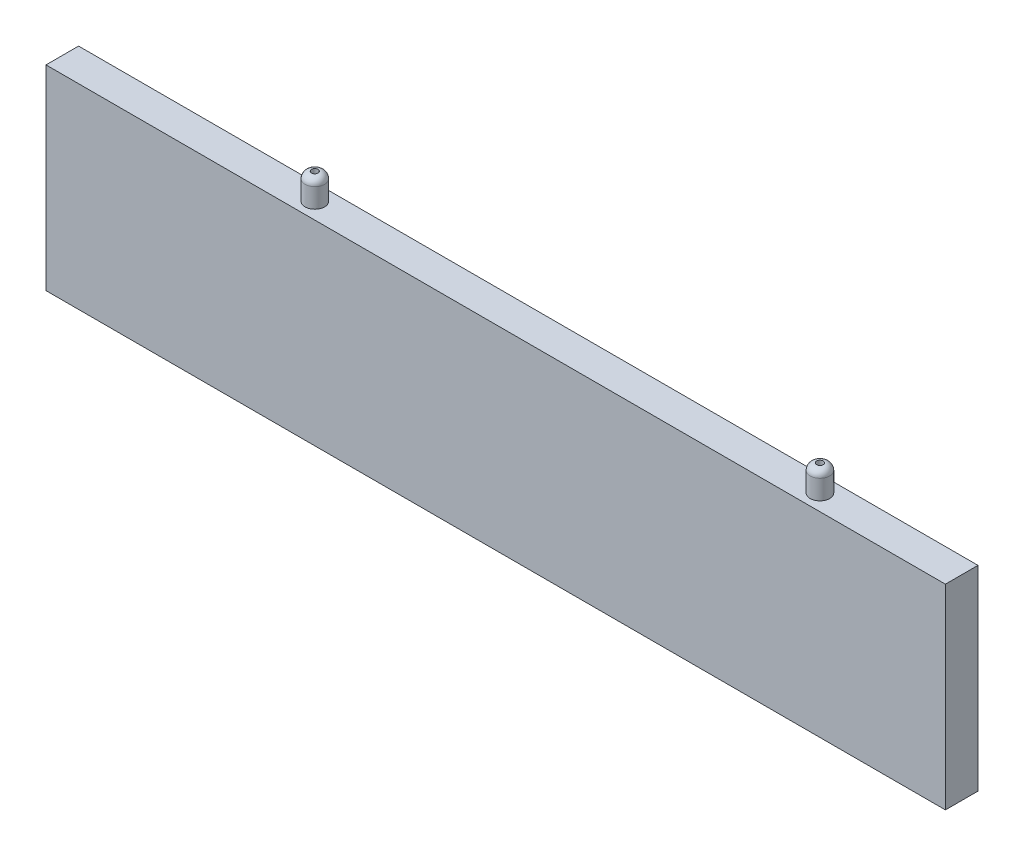
ISO-10303-21;
HEADER;
FILE_DESCRIPTION(('STEP AP214'),'2;1');
FILE_NAME('part.step','',(''),(''),'','','');
FILE_SCHEMA(('AUTOMOTIVE_DESIGN { 1 0 10303 214 1 1 1 1 }'));
ENDSEC;
DATA;
#1=APPLICATION_CONTEXT('core data for automotive mechanical design processes');
#2=APPLICATION_PROTOCOL_DEFINITION('international standard','automotive_design',2000,#1);
#3=PRODUCT_CONTEXT('',#1,'mechanical');
#4=PRODUCT('Part','Part','',(#3));
#5=PRODUCT_RELATED_PRODUCT_CATEGORY('part','',(#4));
#6=PRODUCT_DEFINITION_FORMATION('','',#4);
#7=PRODUCT_DEFINITION_CONTEXT('part definition',#1,'design');
#8=PRODUCT_DEFINITION('design','',#6,#7);
#9=PRODUCT_DEFINITION_SHAPE('','',#8);
#10=(LENGTH_UNIT() NAMED_UNIT(*) SI_UNIT(.MILLI.,.METRE.));
#11=(NAMED_UNIT(*) PLANE_ANGLE_UNIT() SI_UNIT($,.RADIAN.));
#12=(NAMED_UNIT(*) SI_UNIT($,.STERADIAN.) SOLID_ANGLE_UNIT());
#13=UNCERTAINTY_MEASURE_WITH_UNIT(LENGTH_MEASURE(1.E-05),#10,'distance_accuracy_value','');
#14=(GEOMETRIC_REPRESENTATION_CONTEXT(3) GLOBAL_UNCERTAINTY_ASSIGNED_CONTEXT((#13)) GLOBAL_UNIT_ASSIGNED_CONTEXT((#10,
#11,#12)) REPRESENTATION_CONTEXT('',''));
#15=CARTESIAN_POINT('',(0.,0.,0.));
#16=DIRECTION('',(0.,0.,1.));
#17=DIRECTION('',(1.,0.,0.));
#18=AXIS2_PLACEMENT_3D('',#15,#16,#17);
#19=CARTESIAN_POINT('',(-77.5000000000001,15.,5.));
#20=DIRECTION('',(0.,-1.,0.));
#21=DIRECTION('',(0.,0.,-1.));
#22=AXIS2_PLACEMENT_3D('',#19,#20,#21);
#23=PLANE('',#22);
#24=CARTESIAN_POINT('',(-38.75,15.,2.5));
#25=DIRECTION('',(0.,-1.,0.));
#26=DIRECTION('',(0.,0.,-1.));
#27=AXIS2_PLACEMENT_3D('',#24,#25,#26);
#28=CIRCLE('',#27,1.5);
#29=CARTESIAN_POINT('',(-38.75,15.,1.));
#30=VERTEX_POINT('',#29);
#31=EDGE_CURVE('E98',#30,#30,#28,.F.);
#32=ORIENTED_EDGE('',*,*,#31,.F.);
#33=EDGE_LOOP('',(#32));
#34=FACE_BOUND('',#33,.T.);
#35=CARTESIAN_POINT('',(38.75,15.,2.5));
#36=DIRECTION('',(0.,-1.,0.));
#37=DIRECTION('',(0.,0.,-1.));
#38=AXIS2_PLACEMENT_3D('',#35,#36,#37);
#39=CIRCLE('',#38,1.5);
#40=CARTESIAN_POINT('',(38.75,15.,1.));
#41=VERTEX_POINT('',#40);
#42=EDGE_CURVE('E101',#41,#41,#39,.F.);
#43=ORIENTED_EDGE('',*,*,#42,.F.);
#44=EDGE_LOOP('',(#43));
#45=FACE_BOUND('',#44,.T.);
#46=DIRECTION('',(0.,0.,1.));
#47=VECTOR('',#46,1.);
#48=CARTESIAN_POINT('',(60.4999999999999,15.,0.));
#49=LINE('',#48,#47);
#50=CARTESIAN_POINT('',(60.4999999999999,15.,0.));
#51=VERTEX_POINT('',#50);
#52=CARTESIAN_POINT('',(60.4999999999999,15.,5.));
#53=VERTEX_POINT('',#52);
#54=EDGE_CURVE('E137',#51,#53,#49,.T.);
#55=ORIENTED_EDGE('',*,*,#54,.F.);
#56=DIRECTION('',(-1.,0.,0.));
#57=VECTOR('',#56,1.);
#58=CARTESIAN_POINT('',(-77.5000000000001,15.,0.));
#59=LINE('',#58,#57);
#60=CARTESIAN_POINT('',(-77.5000000000001,15.,0.));
#61=VERTEX_POINT('',#60);
#62=EDGE_CURVE('E83',#51,#61,#59,.T.);
#63=ORIENTED_EDGE('',*,*,#62,.T.);
#64=DIRECTION('',(0.,0.,-1.));
#65=VECTOR('',#64,1.);
#66=CARTESIAN_POINT('',(-77.5000000000001,15.,5.));
#67=LINE('',#66,#65);
#68=CARTESIAN_POINT('',(-77.5000000000001,15.,5.));
#69=VERTEX_POINT('',#68);
#70=EDGE_CURVE('E78',#69,#61,#67,.T.);
#71=ORIENTED_EDGE('',*,*,#70,.F.);
#72=DIRECTION('',(-1.,0.,0.));
#73=VECTOR('',#72,1.);
#74=CARTESIAN_POINT('',(-77.5000000000001,15.,5.));
#75=LINE('',#74,#73);
#76=EDGE_CURVE('E92',#53,#69,#75,.T.);
#77=ORIENTED_EDGE('',*,*,#76,.F.);
#78=EDGE_LOOP('',(#55,#63,#71,#77));
#79=FACE_BOUND('',#78,.T.);
#80=ADVANCED_FACE('F35',(#34,#45,#79),#23,.F.);
#81=CARTESIAN_POINT('',(-77.5000000000001,-15.,5.));
#82=DIRECTION('',(0.,1.,0.));
#83=DIRECTION('',(0.,0.,1.));
#84=AXIS2_PLACEMENT_3D('',#81,#82,#83);
#85=PLANE('',#84);
#86=DIRECTION('',(0.,0.,-1.));
#87=VECTOR('',#86,1.);
#88=CARTESIAN_POINT('',(60.4999999999999,-15.,5.));
#89=LINE('',#88,#87);
#90=CARTESIAN_POINT('',(60.4999999999999,-15.,5.));
#91=VERTEX_POINT('',#90);
#92=CARTESIAN_POINT('',(60.4999999999999,-15.,0.));
#93=VERTEX_POINT('',#92);
#94=EDGE_CURVE('E50',#91,#93,#89,.T.);
#95=ORIENTED_EDGE('',*,*,#94,.F.);
#96=DIRECTION('',(1.,0.,0.));
#97=VECTOR('',#96,1.);
#98=CARTESIAN_POINT('',(-77.5000000000001,-15.,5.));
#99=LINE('',#98,#97);
#100=CARTESIAN_POINT('',(-77.5000000000001,-15.,5.));
#101=VERTEX_POINT('',#100);
#102=EDGE_CURVE('E88',#101,#91,#99,.T.);
#103=ORIENTED_EDGE('',*,*,#102,.F.);
#104=DIRECTION('',(0.,0.,-1.));
#105=VECTOR('',#104,1.);
#106=CARTESIAN_POINT('',(-77.5000000000001,-15.,5.));
#107=LINE('',#106,#105);
#108=CARTESIAN_POINT('',(-77.5000000000001,-15.,0.));
#109=VERTEX_POINT('',#108);
#110=EDGE_CURVE('E75',#101,#109,#107,.T.);
#111=ORIENTED_EDGE('',*,*,#110,.T.);
#112=DIRECTION('',(1.,0.,0.));
#113=VECTOR('',#112,1.);
#114=CARTESIAN_POINT('',(-77.5000000000001,-15.,0.));
#115=LINE('',#114,#113);
#116=EDGE_CURVE('E82',#109,#93,#115,.T.);
#117=ORIENTED_EDGE('',*,*,#116,.T.);
#118=EDGE_LOOP('',(#95,#103,#111,#117));
#119=FACE_BOUND('',#118,.T.);
#120=ADVANCED_FACE('F87',(#119),#85,.F.);
#121=CARTESIAN_POINT('',(0.,0.,5.));
#122=DIRECTION('',(0.,0.,1.));
#123=DIRECTION('',(1.,0.,0.));
#124=AXIS2_PLACEMENT_3D('',#121,#122,#123);
#125=PLANE('',#124);
#126=ORIENTED_EDGE('',*,*,#102,.T.);
#127=DIRECTION('',(0.,-1.,0.));
#128=VECTOR('',#127,1.);
#129=CARTESIAN_POINT('',(60.4999999999999,15.,5.));
#130=LINE('',#129,#128);
#131=EDGE_CURVE('E124',#53,#91,#130,.T.);
#132=ORIENTED_EDGE('',*,*,#131,.F.);
#133=ORIENTED_EDGE('',*,*,#76,.T.);
#134=DIRECTION('',(0.,-1.,0.));
#135=VECTOR('',#134,1.);
#136=CARTESIAN_POINT('',(-77.5000000000001,15.,5.));
#137=LINE('',#136,#135);
#138=EDGE_CURVE('E59',#69,#101,#137,.T.);
#139=ORIENTED_EDGE('',*,*,#138,.T.);
#140=EDGE_LOOP('',(#126,#132,#133,#139));
#141=FACE_BOUND('',#140,.T.);
#142=ADVANCED_FACE('F144',(#141),#125,.T.);
#143=CARTESIAN_POINT('',(0.,0.,0.));
#144=DIRECTION('',(0.,0.,1.));
#145=DIRECTION('',(1.,0.,0.));
#146=AXIS2_PLACEMENT_3D('',#143,#144,#145);
#147=PLANE('',#146);
#148=DIRECTION('',(0.,1.,0.));
#149=VECTOR('',#148,1.);
#150=CARTESIAN_POINT('',(60.4999999999999,-15.,0.));
#151=LINE('',#150,#149);
#152=EDGE_CURVE('E91',#93,#51,#151,.T.);
#153=ORIENTED_EDGE('',*,*,#152,.F.);
#154=ORIENTED_EDGE('',*,*,#116,.F.);
#155=DIRECTION('',(0.,-1.,0.));
#156=VECTOR('',#155,1.);
#157=CARTESIAN_POINT('',(-77.5000000000001,15.,0.));
#158=LINE('',#157,#156);
#159=EDGE_CURVE('E72',#61,#109,#158,.T.);
#160=ORIENTED_EDGE('',*,*,#159,.F.);
#161=ORIENTED_EDGE('',*,*,#62,.F.);
#162=EDGE_LOOP('',(#153,#154,#160,#161));
#163=FACE_BOUND('',#162,.T.);
#164=ADVANCED_FACE('F90',(#163),#147,.F.);
#165=CARTESIAN_POINT('',(-77.5000000000001,15.,5.));
#166=DIRECTION('',(1.,0.,0.));
#167=DIRECTION('',(0.,1.,0.));
#168=AXIS2_PLACEMENT_3D('',#165,#166,#167);
#169=PLANE('',#168);
#170=ORIENTED_EDGE('',*,*,#159,.T.);
#171=ORIENTED_EDGE('',*,*,#110,.F.);
#172=ORIENTED_EDGE('',*,*,#138,.F.);
#173=ORIENTED_EDGE('',*,*,#70,.T.);
#174=EDGE_LOOP('',(#170,#171,#172,#173));
#175=FACE_BOUND('',#174,.T.);
#176=ADVANCED_FACE('F74',(#175),#169,.F.);
#177=CARTESIAN_POINT('',(-38.75,19.,2.5));
#178=DIRECTION('',(0.,-1.,0.));
#179=DIRECTION('',(0.,0.,-1.));
#180=AXIS2_PLACEMENT_3D('',#177,#178,#179);
#181=CYLINDRICAL_SURFACE('',#180,1.5);
#182=CARTESIAN_POINT('',(-38.75,18.,2.5));
#183=DIRECTION('',(0.,1.,0.));
#184=DIRECTION('',(0.,0.,1.));
#185=AXIS2_PLACEMENT_3D('',#182,#183,#184);
#186=CIRCLE('',#185,1.5);
#187=CARTESIAN_POINT('',(-38.75,18.,4.));
#188=VERTEX_POINT('',#187);
#189=EDGE_CURVE('E11',#188,#188,#186,.F.);
#190=ORIENTED_EDGE('',*,*,#189,.T.);
#191=EDGE_LOOP('',(#190));
#192=FACE_BOUND('',#191,.T.);
#193=ORIENTED_EDGE('',*,*,#31,.T.);
#194=EDGE_LOOP('',(#193));
#195=FACE_BOUND('',#194,.T.);
#196=ADVANCED_FACE('F177',(#192,#195),#181,.T.);
#197=CARTESIAN_POINT('',(-38.75,19.,2.5));
#198=DIRECTION('',(0.,-1.,0.));
#199=DIRECTION('',(0.,0.,-1.));
#200=AXIS2_PLACEMENT_3D('',#197,#198,#199);
#201=CYLINDRICAL_SURFACE('',#200,0.499999999999999);
#202=CARTESIAN_POINT('',(-38.75,19.,2.5));
#203=DIRECTION('',(0.,1.,0.));
#204=DIRECTION('',(0.,0.,1.));
#205=AXIS2_PLACEMENT_3D('',#202,#203,#204);
#206=CIRCLE('',#205,0.499999999999999);
#207=CARTESIAN_POINT('',(-38.75,19.,3.));
#208=VERTEX_POINT('',#207);
#209=EDGE_CURVE('E121',#208,#208,#206,.T.);
#210=ORIENTED_EDGE('',*,*,#209,.T.);
#211=EDGE_LOOP('',(#210));
#212=FACE_BOUND('',#211,.T.);
#213=CARTESIAN_POINT('',(-38.75,15.,2.5));
#214=DIRECTION('',(0.,1.,0.));
#215=DIRECTION('',(0.,0.,1.));
#216=AXIS2_PLACEMENT_3D('',#213,#214,#215);
#217=CIRCLE('',#216,0.499999999999999);
#218=CARTESIAN_POINT('',(-38.75,15.,3.));
#219=VERTEX_POINT('',#218);
#220=EDGE_CURVE('E117',#219,#219,#217,.T.);
#221=ORIENTED_EDGE('',*,*,#220,.F.);
#222=EDGE_LOOP('',(#221));
#223=FACE_BOUND('',#222,.T.);
#224=ADVANCED_FACE('F168',(#212,#223),#201,.F.);
#225=ORIENTED_EDGE('',*,*,#220,.T.);
#226=EDGE_LOOP('',(#225));
#227=FACE_BOUND('',#226,.T.);
#228=ADVANCED_FACE('F157',(#227),#23,.F.);
#229=CARTESIAN_POINT('',(38.75,19.,2.5));
#230=DIRECTION('',(0.,-1.,0.));
#231=DIRECTION('',(0.,0.,-1.));
#232=AXIS2_PLACEMENT_3D('',#229,#230,#231);
#233=CYLINDRICAL_SURFACE('',#232,1.5);
#234=CARTESIAN_POINT('',(38.75,18.,2.5));
#235=DIRECTION('',(0.,-1.,0.));
#236=DIRECTION('',(0.,0.,-1.));
#237=AXIS2_PLACEMENT_3D('',#234,#235,#236);
#238=CIRCLE('',#237,1.5);
#239=CARTESIAN_POINT('',(38.75,18.,1.));
#240=VERTEX_POINT('',#239);
#241=EDGE_CURVE('E43',#240,#240,#238,.T.);
#242=ORIENTED_EDGE('',*,*,#241,.T.);
#243=EDGE_LOOP('',(#242));
#244=FACE_BOUND('',#243,.T.);
#245=ORIENTED_EDGE('',*,*,#42,.T.);
#246=EDGE_LOOP('',(#245));
#247=FACE_BOUND('',#246,.T.);
#248=ADVANCED_FACE('F106',(#244,#247),#233,.T.);
#249=CARTESIAN_POINT('',(38.75,19.,2.5));
#250=DIRECTION('',(0.,-1.,0.));
#251=DIRECTION('',(0.,0.,-1.));
#252=AXIS2_PLACEMENT_3D('',#249,#250,#251);
#253=CYLINDRICAL_SURFACE('',#252,0.499999999999999);
#254=CARTESIAN_POINT('',(38.75,19.,2.5));
#255=DIRECTION('',(0.,1.,0.));
#256=DIRECTION('',(0.,0.,1.));
#257=AXIS2_PLACEMENT_3D('',#254,#255,#256);
#258=CIRCLE('',#257,0.499999999999999);
#259=CARTESIAN_POINT('',(38.75,19.,3.));
#260=VERTEX_POINT('',#259);
#261=EDGE_CURVE('E115',#260,#260,#258,.T.);
#262=ORIENTED_EDGE('',*,*,#261,.T.);
#263=EDGE_LOOP('',(#262));
#264=FACE_BOUND('',#263,.T.);
#265=CARTESIAN_POINT('',(38.75,15.,2.5));
#266=DIRECTION('',(0.,1.,0.));
#267=DIRECTION('',(0.,0.,1.));
#268=AXIS2_PLACEMENT_3D('',#265,#266,#267);
#269=CIRCLE('',#268,0.499999999999999);
#270=CARTESIAN_POINT('',(38.75,15.,3.));
#271=VERTEX_POINT('',#270);
#272=EDGE_CURVE('E118',#271,#271,#269,.T.);
#273=ORIENTED_EDGE('',*,*,#272,.F.);
#274=EDGE_LOOP('',(#273));
#275=FACE_BOUND('',#274,.T.);
#276=ADVANCED_FACE('F165',(#264,#275),#253,.F.);
#277=ORIENTED_EDGE('',*,*,#272,.T.);
#278=EDGE_LOOP('',(#277));
#279=FACE_BOUND('',#278,.T.);
#280=ADVANCED_FACE('F112',(#279),#23,.F.);
#281=CARTESIAN_POINT('',(38.75,18.,2.5));
#282=DIRECTION('',(0.,-1.,0.));
#283=DIRECTION('',(0.,0.,-1.));
#284=AXIS2_PLACEMENT_3D('',#281,#282,#283);
#285=DEGENERATE_TOROIDAL_SURFACE('',#284,0.499999999999997,1.,.T.);
#286=ORIENTED_EDGE('',*,*,#241,.F.);
#287=EDGE_LOOP('',(#286));
#288=FACE_BOUND('',#287,.T.);
#289=ORIENTED_EDGE('',*,*,#261,.F.);
#290=EDGE_LOOP('',(#289));
#291=FACE_BOUND('',#290,.T.);
#292=ADVANCED_FACE('F109',(#288,#291),#285,.T.);
#293=CARTESIAN_POINT('',(-38.75,18.,2.5));
#294=DIRECTION('',(0.,1.,0.));
#295=DIRECTION('',(0.,0.,1.));
#296=AXIS2_PLACEMENT_3D('',#293,#294,#295);
#297=DEGENERATE_TOROIDAL_SURFACE('',#296,0.499999999999997,1.,.T.);
#298=ORIENTED_EDGE('',*,*,#189,.F.);
#299=EDGE_LOOP('',(#298));
#300=FACE_BOUND('',#299,.T.);
#301=ORIENTED_EDGE('',*,*,#209,.F.);
#302=EDGE_LOOP('',(#301));
#303=FACE_BOUND('',#302,.T.);
#304=ADVANCED_FACE('F37',(#300,#303),#297,.T.);
#305=CARTESIAN_POINT('',(60.4999999999999,0.,0.));
#306=DIRECTION('',(1.,0.,0.));
#307=DIRECTION('',(0.,1.,0.));
#308=AXIS2_PLACEMENT_3D('',#305,#306,#307);
#309=PLANE('',#308);
#310=ORIENTED_EDGE('',*,*,#94,.T.);
#311=ORIENTED_EDGE('',*,*,#152,.T.);
#312=ORIENTED_EDGE('',*,*,#54,.T.);
#313=ORIENTED_EDGE('',*,*,#131,.T.);
#314=EDGE_LOOP('',(#310,#311,#312,#313));
#315=FACE_BOUND('',#314,.T.);
#316=ADVANCED_FACE('F142',(#315),#309,.T.);
#317=CLOSED_SHELL('',(#80,#120,#142,#164,#176,#196,#224,#228,#248,#276,#280,#292,#304,#316));
#318=MANIFOLD_SOLID_BREP('B2',#317);
#319=ADVANCED_BREP_SHAPE_REPRESENTATION('',(#18,#318),#14);
#320=SHAPE_DEFINITION_REPRESENTATION(#9,#319);
ENDSEC;
END-ISO-10303-21;
